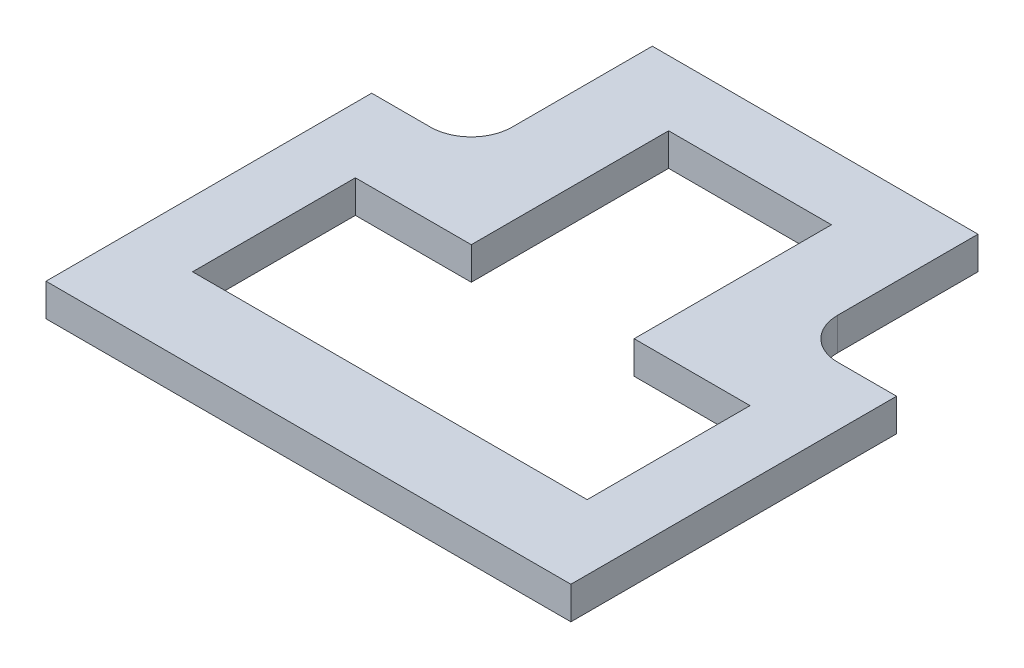
ISO-10303-21;
HEADER;
FILE_DESCRIPTION(('STEP AP214'),'2;1');
FILE_NAME('part.step','',(''),(''),'','','');
FILE_SCHEMA(('AUTOMOTIVE_DESIGN { 1 0 10303 214 1 1 1 1 }'));
ENDSEC;
DATA;
#1=APPLICATION_CONTEXT('core data for automotive mechanical design processes');
#2=APPLICATION_PROTOCOL_DEFINITION('international standard','automotive_design',2000,#1);
#3=PRODUCT_CONTEXT('',#1,'mechanical');
#4=PRODUCT('Part','Part','',(#3));
#5=PRODUCT_RELATED_PRODUCT_CATEGORY('part','',(#4));
#6=PRODUCT_DEFINITION_FORMATION('','',#4);
#7=PRODUCT_DEFINITION_CONTEXT('part definition',#1,'design');
#8=PRODUCT_DEFINITION('design','',#6,#7);
#9=PRODUCT_DEFINITION_SHAPE('','',#8);
#10=(LENGTH_UNIT() NAMED_UNIT(*) SI_UNIT(.MILLI.,.METRE.));
#11=(NAMED_UNIT(*) PLANE_ANGLE_UNIT() SI_UNIT($,.RADIAN.));
#12=(NAMED_UNIT(*) SI_UNIT($,.STERADIAN.) SOLID_ANGLE_UNIT());
#13=UNCERTAINTY_MEASURE_WITH_UNIT(LENGTH_MEASURE(1.E-05),#10,'distance_accuracy_value','');
#14=(GEOMETRIC_REPRESENTATION_CONTEXT(3) GLOBAL_UNCERTAINTY_ASSIGNED_CONTEXT((#13)) GLOBAL_UNIT_ASSIGNED_CONTEXT((#10,
#11,#12)) REPRESENTATION_CONTEXT('',''));
#15=CARTESIAN_POINT('',(0.,0.,0.));
#16=DIRECTION('',(0.,0.,1.));
#17=DIRECTION('',(1.,0.,0.));
#18=AXIS2_PLACEMENT_3D('',#15,#16,#17);
#19=CARTESIAN_POINT('',(37.5,14.,-7.49999999999994));
#20=DIRECTION('',(0.,-1.,0.));
#21=DIRECTION('',(0.,0.,-1.));
#22=AXIS2_PLACEMENT_3D('',#19,#20,#21);
#23=CYLINDRICAL_SURFACE('',#22,7.49999999999994);
#24=DIRECTION('',(0.,-1.,0.));
#25=VECTOR('',#24,1.);
#26=CARTESIAN_POINT('',(37.5,14.,0.));
#27=LINE('',#26,#25);
#28=CARTESIAN_POINT('',(37.5,14.,0.));
#29=VERTEX_POINT('',#28);
#30=CARTESIAN_POINT('',(37.5,8.,0.));
#31=VERTEX_POINT('',#30);
#32=EDGE_CURVE('E291',#29,#31,#27,.T.);
#33=ORIENTED_EDGE('',*,*,#32,.T.);
#34=CARTESIAN_POINT('',(37.5,8.,-7.49999999999994));
#35=DIRECTION('',(0.,1.,0.));
#36=DIRECTION('',(0.,0.,1.));
#37=AXIS2_PLACEMENT_3D('',#34,#35,#36);
#38=CIRCLE('',#37,7.49999999999994);
#39=CARTESIAN_POINT('',(30.,8.,-7.5));
#40=VERTEX_POINT('',#39);
#41=EDGE_CURVE('E249',#31,#40,#38,.F.);
#42=ORIENTED_EDGE('',*,*,#41,.T.);
#43=DIRECTION('',(0.,-1.,0.));
#44=VECTOR('',#43,1.);
#45=CARTESIAN_POINT('',(30.,14.,-7.5));
#46=LINE('',#45,#44);
#47=CARTESIAN_POINT('',(30.,14.,-7.5));
#48=VERTEX_POINT('',#47);
#49=EDGE_CURVE('E295',#48,#40,#46,.T.);
#50=ORIENTED_EDGE('',*,*,#49,.F.);
#51=CARTESIAN_POINT('',(37.5,14.,-7.49999999999994));
#52=DIRECTION('',(0.,-1.,0.));
#53=DIRECTION('',(0.,0.,-1.));
#54=AXIS2_PLACEMENT_3D('',#51,#52,#53);
#55=CIRCLE('',#54,7.49999999999994);
#56=EDGE_CURVE('E272',#29,#48,#55,.T.);
#57=ORIENTED_EDGE('',*,*,#56,.F.);
#58=EDGE_LOOP('',(#33,#42,#50,#57));
#59=FACE_BOUND('',#58,.T.);
#60=ADVANCED_FACE('F40',(#59),#23,.F.);
#61=CARTESIAN_POINT('',(-37.5,14.,-7.5));
#62=DIRECTION('',(0.,-1.,0.));
#63=DIRECTION('',(0.,0.,-1.));
#64=AXIS2_PLACEMENT_3D('',#61,#62,#63);
#65=CYLINDRICAL_SURFACE('',#64,7.5);
#66=DIRECTION('',(0.,-1.,0.));
#67=VECTOR('',#66,1.);
#68=CARTESIAN_POINT('',(-30.,14.,-7.5));
#69=LINE('',#68,#67);
#70=CARTESIAN_POINT('',(-30.,14.,-7.5));
#71=VERTEX_POINT('',#70);
#72=CARTESIAN_POINT('',(-30.,8.,-7.5));
#73=VERTEX_POINT('',#72);
#74=EDGE_CURVE('E298',#71,#73,#69,.T.);
#75=ORIENTED_EDGE('',*,*,#74,.T.);
#76=CARTESIAN_POINT('',(-37.5,8.,-7.5));
#77=DIRECTION('',(0.,1.,0.));
#78=DIRECTION('',(0.,0.,1.));
#79=AXIS2_PLACEMENT_3D('',#76,#77,#78);
#80=CIRCLE('',#79,7.5);
#81=CARTESIAN_POINT('',(-37.5,8.,0.));
#82=VERTEX_POINT('',#81);
#83=EDGE_CURVE('E246',#73,#82,#80,.F.);
#84=ORIENTED_EDGE('',*,*,#83,.T.);
#85=DIRECTION('',(0.,-1.,0.));
#86=VECTOR('',#85,1.);
#87=CARTESIAN_POINT('',(-37.5,14.,0.));
#88=LINE('',#87,#86);
#89=CARTESIAN_POINT('',(-37.5,14.,0.));
#90=VERTEX_POINT('',#89);
#91=EDGE_CURVE('E290',#90,#82,#88,.T.);
#92=ORIENTED_EDGE('',*,*,#91,.F.);
#93=CARTESIAN_POINT('',(-37.5,14.,-7.5));
#94=DIRECTION('',(0.,-1.,0.));
#95=DIRECTION('',(0.,0.,-1.));
#96=AXIS2_PLACEMENT_3D('',#93,#94,#95);
#97=CIRCLE('',#96,7.5);
#98=EDGE_CURVE('E266',#71,#90,#97,.T.);
#99=ORIENTED_EDGE('',*,*,#98,.F.);
#100=EDGE_LOOP('',(#75,#84,#92,#99));
#101=FACE_BOUND('',#100,.T.);
#102=ADVANCED_FACE('F346',(#101),#65,.F.);
#103=CARTESIAN_POINT('',(0.,14.,0.));
#104=DIRECTION('',(0.,-1.,0.));
#105=DIRECTION('',(0.,0.,-1.));
#106=AXIS2_PLACEMENT_3D('',#103,#104,#105);
#107=PLANE('',#106);
#108=DIRECTION('',(1.,0.,0.));
#109=VECTOR('',#108,1.);
#110=CARTESIAN_POINT('',(0.,14.,45.));
#111=LINE('',#110,#109);
#112=CARTESIAN_POINT('',(-36.35,14.,45.));
#113=VERTEX_POINT('',#112);
#114=CARTESIAN_POINT('',(36.35,14.,45.));
#115=VERTEX_POINT('',#114);
#116=EDGE_CURVE('E281',#113,#115,#111,.T.);
#117=ORIENTED_EDGE('',*,*,#116,.F.);
#118=DIRECTION('',(0.,0.,1.));
#119=VECTOR('',#118,1.);
#120=CARTESIAN_POINT('',(-36.35,14.,15.));
#121=LINE('',#120,#119);
#122=CARTESIAN_POINT('',(-36.35,14.,15.));
#123=VERTEX_POINT('',#122);
#124=EDGE_CURVE('E206',#123,#113,#121,.T.);
#125=ORIENTED_EDGE('',*,*,#124,.F.);
#126=DIRECTION('',(-1.,0.,0.));
#127=VECTOR('',#126,1.);
#128=CARTESIAN_POINT('',(0.,14.,15.));
#129=LINE('',#128,#127);
#130=CARTESIAN_POINT('',(-15.,14.,15.));
#131=VERTEX_POINT('',#130);
#132=EDGE_CURVE('E279',#131,#123,#129,.T.);
#133=ORIENTED_EDGE('',*,*,#132,.F.);
#134=DIRECTION('',(0.,0.,1.));
#135=VECTOR('',#134,1.);
#136=CARTESIAN_POINT('',(-15.,14.,0.));
#137=LINE('',#136,#135);
#138=CARTESIAN_POINT('',(-15.,14.,-21.35));
#139=VERTEX_POINT('',#138);
#140=EDGE_CURVE('E288',#139,#131,#137,.T.);
#141=ORIENTED_EDGE('',*,*,#140,.F.);
#142=DIRECTION('',(-1.,0.,0.));
#143=VECTOR('',#142,1.);
#144=CARTESIAN_POINT('',(-15.,14.,-21.35));
#145=LINE('',#144,#143);
#146=CARTESIAN_POINT('',(15.,14.,-21.35));
#147=VERTEX_POINT('',#146);
#148=EDGE_CURVE('E233',#147,#139,#145,.T.);
#149=ORIENTED_EDGE('',*,*,#148,.F.);
#150=DIRECTION('',(0.,0.,-1.));
#151=VECTOR('',#150,1.);
#152=CARTESIAN_POINT('',(15.,14.,0.));
#153=LINE('',#152,#151);
#154=CARTESIAN_POINT('',(15.,14.,15.));
#155=VERTEX_POINT('',#154);
#156=EDGE_CURVE('E286',#155,#147,#153,.T.);
#157=ORIENTED_EDGE('',*,*,#156,.F.);
#158=DIRECTION('',(-1.,0.,0.));
#159=VECTOR('',#158,1.);
#160=CARTESIAN_POINT('',(0.,14.,15.));
#161=LINE('',#160,#159);
#162=CARTESIAN_POINT('',(36.35,14.,15.));
#163=VERTEX_POINT('',#162);
#164=EDGE_CURVE('E283',#163,#155,#161,.T.);
#165=ORIENTED_EDGE('',*,*,#164,.F.);
#166=DIRECTION('',(0.,0.,-1.));
#167=VECTOR('',#166,1.);
#168=CARTESIAN_POINT('',(36.35,14.,15.));
#169=LINE('',#168,#167);
#170=EDGE_CURVE('E203',#115,#163,#169,.T.);
#171=ORIENTED_EDGE('',*,*,#170,.F.);
#172=EDGE_LOOP('',(#117,#125,#133,#141,#149,#157,#165,#171));
#173=FACE_BOUND('',#172,.T.);
#174=ORIENTED_EDGE('',*,*,#56,.T.);
#175=DIRECTION('',(0.,0.,1.));
#176=VECTOR('',#175,1.);
#177=CARTESIAN_POINT('',(30.,14.,0.));
#178=LINE('',#177,#176);
#179=CARTESIAN_POINT('',(30.,14.,-33.35));
#180=VERTEX_POINT('',#179);
#181=EDGE_CURVE('E270',#180,#48,#178,.T.);
#182=ORIENTED_EDGE('',*,*,#181,.F.);
#183=DIRECTION('',(-1.,0.,0.));
#184=VECTOR('',#183,1.);
#185=CARTESIAN_POINT('',(-30.,14.,-33.35));
#186=LINE('',#185,#184);
#187=CARTESIAN_POINT('',(-30.,14.,-33.35));
#188=VERTEX_POINT('',#187);
#189=EDGE_CURVE('E214',#180,#188,#186,.T.);
#190=ORIENTED_EDGE('',*,*,#189,.T.);
#191=DIRECTION('',(0.,0.,-1.));
#192=VECTOR('',#191,1.);
#193=CARTESIAN_POINT('',(-30.,14.,0.));
#194=LINE('',#193,#192);
#195=EDGE_CURVE('E268',#71,#188,#194,.T.);
#196=ORIENTED_EDGE('',*,*,#195,.F.);
#197=ORIENTED_EDGE('',*,*,#98,.T.);
#198=DIRECTION('',(1.,0.,0.));
#199=VECTOR('',#198,1.);
#200=CARTESIAN_POINT('',(0.,14.,0.));
#201=LINE('',#200,#199);
#202=CARTESIAN_POINT('',(-48.35,14.,0.));
#203=VERTEX_POINT('',#202);
#204=EDGE_CURVE('E263',#203,#90,#201,.T.);
#205=ORIENTED_EDGE('',*,*,#204,.F.);
#206=DIRECTION('',(0.,0.,1.));
#207=VECTOR('',#206,1.);
#208=CARTESIAN_POINT('',(-48.35,14.,0.));
#209=LINE('',#208,#207);
#210=CARTESIAN_POINT('',(-48.35,14.,60.));
#211=VERTEX_POINT('',#210);
#212=EDGE_CURVE('E195',#203,#211,#209,.T.);
#213=ORIENTED_EDGE('',*,*,#212,.T.);
#214=DIRECTION('',(-1.,0.,0.));
#215=VECTOR('',#214,1.);
#216=CARTESIAN_POINT('',(0.,14.,60.));
#217=LINE('',#216,#215);
#218=CARTESIAN_POINT('',(48.35,14.,60.));
#219=VERTEX_POINT('',#218);
#220=EDGE_CURVE('E277',#219,#211,#217,.T.);
#221=ORIENTED_EDGE('',*,*,#220,.F.);
#222=DIRECTION('',(0.,0.,-1.));
#223=VECTOR('',#222,1.);
#224=CARTESIAN_POINT('',(48.35,14.,0.));
#225=LINE('',#224,#223);
#226=CARTESIAN_POINT('',(48.35,14.,0.));
#227=VERTEX_POINT('',#226);
#228=EDGE_CURVE('E184',#219,#227,#225,.T.);
#229=ORIENTED_EDGE('',*,*,#228,.T.);
#230=DIRECTION('',(1.,0.,0.));
#231=VECTOR('',#230,1.);
#232=CARTESIAN_POINT('',(0.,14.,0.));
#233=LINE('',#232,#231);
#234=EDGE_CURVE('E275',#29,#227,#233,.T.);
#235=ORIENTED_EDGE('',*,*,#234,.F.);
#236=EDGE_LOOP('',(#174,#182,#190,#196,#197,#205,#213,#221,#229,#235));
#237=FACE_BOUND('',#236,.T.);
#238=ADVANCED_FACE('F324',(#173,#237),#107,.F.);
#239=CARTESIAN_POINT('',(-30.,6.,-30.));
#240=DIRECTION('',(1.,0.,0.));
#241=DIRECTION('',(0.,0.,-1.));
#242=AXIS2_PLACEMENT_3D('',#239,#240,#241);
#243=PLANE('',#242);
#244=ORIENTED_EDGE('',*,*,#195,.T.);
#245=DIRECTION('',(0.,1.,0.));
#246=VECTOR('',#245,1.);
#247=CARTESIAN_POINT('',(-30.,8.,-33.35));
#248=LINE('',#247,#246);
#249=CARTESIAN_POINT('',(-30.,8.,-33.35));
#250=VERTEX_POINT('',#249);
#251=EDGE_CURVE('E230',#250,#188,#248,.T.);
#252=ORIENTED_EDGE('',*,*,#251,.F.);
#253=DIRECTION('',(0.,0.,1.));
#254=VECTOR('',#253,1.);
#255=CARTESIAN_POINT('',(-30.,8.,-30.));
#256=LINE('',#255,#254);
#257=EDGE_CURVE('E244',#250,#73,#256,.T.);
#258=ORIENTED_EDGE('',*,*,#257,.T.);
#259=ORIENTED_EDGE('',*,*,#74,.F.);
#260=EDGE_LOOP('',(#244,#252,#258,#259));
#261=FACE_BOUND('',#260,.T.);
#262=ADVANCED_FACE('F42',(#261),#243,.F.);
#263=CARTESIAN_POINT('',(45.,6.,0.));
#264=DIRECTION('',(0.,0.,1.));
#265=DIRECTION('',(1.,0.,0.));
#266=AXIS2_PLACEMENT_3D('',#263,#264,#265);
#267=PLANE('',#266);
#268=ORIENTED_EDGE('',*,*,#234,.T.);
#269=DIRECTION('',(0.,1.,0.));
#270=VECTOR('',#269,1.);
#271=CARTESIAN_POINT('',(48.35,8.,0.));
#272=LINE('',#271,#270);
#273=CARTESIAN_POINT('',(48.35,8.,0.));
#274=VERTEX_POINT('',#273);
#275=EDGE_CURVE('E185',#274,#227,#272,.T.);
#276=ORIENTED_EDGE('',*,*,#275,.F.);
#277=DIRECTION('',(-1.,0.,0.));
#278=VECTOR('',#277,1.);
#279=CARTESIAN_POINT('',(45.,8.,0.));
#280=LINE('',#279,#278);
#281=EDGE_CURVE('E190',#274,#31,#280,.T.);
#282=ORIENTED_EDGE('',*,*,#281,.T.);
#283=ORIENTED_EDGE('',*,*,#32,.F.);
#284=EDGE_LOOP('',(#268,#276,#282,#283));
#285=FACE_BOUND('',#284,.T.);
#286=ADVANCED_FACE('F371',(#285),#267,.F.);
#287=CARTESIAN_POINT('',(-30.,6.,0.));
#288=DIRECTION('',(0.,0.,1.));
#289=DIRECTION('',(1.,0.,0.));
#290=AXIS2_PLACEMENT_3D('',#287,#288,#289);
#291=PLANE('',#290);
#292=ORIENTED_EDGE('',*,*,#91,.T.);
#293=DIRECTION('',(-1.,0.,0.));
#294=VECTOR('',#293,1.);
#295=CARTESIAN_POINT('',(-30.,8.,0.));
#296=LINE('',#295,#294);
#297=CARTESIAN_POINT('',(-48.35,8.,0.));
#298=VERTEX_POINT('',#297);
#299=EDGE_CURVE('E252',#82,#298,#296,.T.);
#300=ORIENTED_EDGE('',*,*,#299,.T.);
#301=DIRECTION('',(0.,1.,0.));
#302=VECTOR('',#301,1.);
#303=CARTESIAN_POINT('',(-48.35,8.,0.));
#304=LINE('',#303,#302);
#305=EDGE_CURVE('E199',#298,#203,#304,.T.);
#306=ORIENTED_EDGE('',*,*,#305,.T.);
#307=ORIENTED_EDGE('',*,*,#204,.T.);
#308=EDGE_LOOP('',(#292,#300,#306,#307));
#309=FACE_BOUND('',#308,.T.);
#310=ADVANCED_FACE('F374',(#309),#291,.F.);
#311=CARTESIAN_POINT('',(-45.,6.,60.));
#312=DIRECTION('',(0.,0.,-1.));
#313=DIRECTION('',(-1.,0.,0.));
#314=AXIS2_PLACEMENT_3D('',#311,#312,#313);
#315=PLANE('',#314);
#316=ORIENTED_EDGE('',*,*,#220,.T.);
#317=DIRECTION('',(0.,1.,0.));
#318=VECTOR('',#317,1.);
#319=CARTESIAN_POINT('',(-48.35,8.,60.));
#320=LINE('',#319,#318);
#321=CARTESIAN_POINT('',(-48.35,8.,60.));
#322=VERTEX_POINT('',#321);
#323=EDGE_CURVE('E170',#322,#211,#320,.T.);
#324=ORIENTED_EDGE('',*,*,#323,.F.);
#325=DIRECTION('',(-1.,0.,0.));
#326=VECTOR('',#325,1.);
#327=CARTESIAN_POINT('',(-45.,8.,60.));
#328=LINE('',#327,#326);
#329=CARTESIAN_POINT('',(48.35,8.,60.));
#330=VERTEX_POINT('',#329);
#331=EDGE_CURVE('E164',#330,#322,#328,.T.);
#332=ORIENTED_EDGE('',*,*,#331,.F.);
#333=DIRECTION('',(0.,1.,0.));
#334=VECTOR('',#333,1.);
#335=CARTESIAN_POINT('',(48.35,8.,60.));
#336=LINE('',#335,#334);
#337=EDGE_CURVE('E167',#330,#219,#336,.T.);
#338=ORIENTED_EDGE('',*,*,#337,.T.);
#339=EDGE_LOOP('',(#316,#324,#332,#338));
#340=FACE_BOUND('',#339,.T.);
#341=ADVANCED_FACE('F166',(#340),#315,.F.);
#342=CARTESIAN_POINT('',(30.,6.,0.));
#343=DIRECTION('',(-1.,0.,0.));
#344=DIRECTION('',(0.,0.,1.));
#345=AXIS2_PLACEMENT_3D('',#342,#343,#344);
#346=PLANE('',#345);
#347=DIRECTION('',(0.,0.,-1.));
#348=VECTOR('',#347,1.);
#349=CARTESIAN_POINT('',(30.,8.,0.));
#350=LINE('',#349,#348);
#351=CARTESIAN_POINT('',(30.,8.,-33.35));
#352=VERTEX_POINT('',#351);
#353=EDGE_CURVE('E175',#40,#352,#350,.T.);
#354=ORIENTED_EDGE('',*,*,#353,.T.);
#355=DIRECTION('',(0.,1.,0.));
#356=VECTOR('',#355,1.);
#357=CARTESIAN_POINT('',(30.,8.,-33.35));
#358=LINE('',#357,#356);
#359=EDGE_CURVE('E227',#352,#180,#358,.T.);
#360=ORIENTED_EDGE('',*,*,#359,.T.);
#361=ORIENTED_EDGE('',*,*,#181,.T.);
#362=ORIENTED_EDGE('',*,*,#49,.T.);
#363=EDGE_LOOP('',(#354,#360,#361,#362));
#364=FACE_BOUND('',#363,.T.);
#365=ADVANCED_FACE('F362',(#364),#346,.F.);
#366=CARTESIAN_POINT('',(30.,6.,45.));
#367=DIRECTION('',(0.,0.,1.));
#368=DIRECTION('',(1.,0.,0.));
#369=AXIS2_PLACEMENT_3D('',#366,#367,#368);
#370=PLANE('',#369);
#371=ORIENTED_EDGE('',*,*,#116,.T.);
#372=DIRECTION('',(0.,1.,0.));
#373=VECTOR('',#372,1.);
#374=CARTESIAN_POINT('',(36.35,4.,45.));
#375=LINE('',#374,#373);
#376=CARTESIAN_POINT('',(36.35,8.,45.));
#377=VERTEX_POINT('',#376);
#378=EDGE_CURVE('E219',#377,#115,#375,.T.);
#379=ORIENTED_EDGE('',*,*,#378,.F.);
#380=DIRECTION('',(-1.,0.,0.));
#381=VECTOR('',#380,1.);
#382=CARTESIAN_POINT('',(30.,8.,45.));
#383=LINE('',#382,#381);
#384=CARTESIAN_POINT('',(-36.35,8.,45.));
#385=VERTEX_POINT('',#384);
#386=EDGE_CURVE('E60',#377,#385,#383,.T.);
#387=ORIENTED_EDGE('',*,*,#386,.T.);
#388=DIRECTION('',(0.,1.,0.));
#389=VECTOR('',#388,1.);
#390=CARTESIAN_POINT('',(-36.35,4.,45.));
#391=LINE('',#390,#389);
#392=EDGE_CURVE('E211',#385,#113,#391,.T.);
#393=ORIENTED_EDGE('',*,*,#392,.T.);
#394=EDGE_LOOP('',(#371,#379,#387,#393));
#395=FACE_BOUND('',#394,.T.);
#396=ADVANCED_FACE('F358',(#395),#370,.F.);
#397=CARTESIAN_POINT('',(15.,6.,15.));
#398=DIRECTION('',(0.,0.,-1.));
#399=DIRECTION('',(-1.,0.,0.));
#400=AXIS2_PLACEMENT_3D('',#397,#398,#399);
#401=PLANE('',#400);
#402=DIRECTION('',(0.,-1.,0.));
#403=VECTOR('',#402,1.);
#404=CARTESIAN_POINT('',(15.,6.,15.));
#405=LINE('',#404,#403);
#406=CARTESIAN_POINT('',(15.,8.,15.));
#407=VERTEX_POINT('',#406);
#408=EDGE_CURVE('E303',#155,#407,#405,.T.);
#409=ORIENTED_EDGE('',*,*,#408,.T.);
#410=DIRECTION('',(1.,0.,0.));
#411=VECTOR('',#410,1.);
#412=CARTESIAN_POINT('',(15.,8.,15.));
#413=LINE('',#412,#411);
#414=CARTESIAN_POINT('',(36.35,8.,15.));
#415=VERTEX_POINT('',#414);
#416=EDGE_CURVE('E259',#407,#415,#413,.T.);
#417=ORIENTED_EDGE('',*,*,#416,.T.);
#418=DIRECTION('',(0.,1.,0.));
#419=VECTOR('',#418,1.);
#420=CARTESIAN_POINT('',(36.35,4.,15.));
#421=LINE('',#420,#419);
#422=EDGE_CURVE('E210',#415,#163,#421,.T.);
#423=ORIENTED_EDGE('',*,*,#422,.T.);
#424=ORIENTED_EDGE('',*,*,#164,.T.);
#425=EDGE_LOOP('',(#409,#417,#423,#424));
#426=FACE_BOUND('',#425,.T.);
#427=ADVANCED_FACE('F317',(#426),#401,.F.);
#428=CARTESIAN_POINT('',(15.,6.,-15.));
#429=DIRECTION('',(1.,0.,0.));
#430=DIRECTION('',(0.,0.,-1.));
#431=AXIS2_PLACEMENT_3D('',#428,#429,#430);
#432=PLANE('',#431);
#433=ORIENTED_EDGE('',*,*,#156,.T.);
#434=DIRECTION('',(0.,1.,0.));
#435=VECTOR('',#434,1.);
#436=CARTESIAN_POINT('',(15.,-5.81200000000001,-21.35));
#437=LINE('',#436,#435);
#438=CARTESIAN_POINT('',(15.,7.99999999999999,-21.35));
#439=VERTEX_POINT('',#438);
#440=EDGE_CURVE('E238',#439,#147,#437,.T.);
#441=ORIENTED_EDGE('',*,*,#440,.F.);
#442=DIRECTION('',(0.,0.,1.));
#443=VECTOR('',#442,1.);
#444=CARTESIAN_POINT('',(15.,8.,-15.));
#445=LINE('',#444,#443);
#446=EDGE_CURVE('E257',#439,#407,#445,.T.);
#447=ORIENTED_EDGE('',*,*,#446,.T.);
#448=ORIENTED_EDGE('',*,*,#408,.F.);
#449=EDGE_LOOP('',(#433,#441,#447,#448));
#450=FACE_BOUND('',#449,.T.);
#451=ADVANCED_FACE('F320',(#450),#432,.F.);
#452=CARTESIAN_POINT('',(-15.,6.,15.));
#453=DIRECTION('',(-1.,0.,0.));
#454=DIRECTION('',(0.,0.,1.));
#455=AXIS2_PLACEMENT_3D('',#452,#453,#454);
#456=PLANE('',#455);
#457=DIRECTION('',(0.,0.,-1.));
#458=VECTOR('',#457,1.);
#459=CARTESIAN_POINT('',(-15.,8.,15.));
#460=LINE('',#459,#458);
#461=CARTESIAN_POINT('',(-15.,8.,15.));
#462=VERTEX_POINT('',#461);
#463=CARTESIAN_POINT('',(-15.,7.99999999999999,-21.35));
#464=VERTEX_POINT('',#463);
#465=EDGE_CURVE('E255',#462,#464,#460,.T.);
#466=ORIENTED_EDGE('',*,*,#465,.T.);
#467=DIRECTION('',(0.,1.,0.));
#468=VECTOR('',#467,1.);
#469=CARTESIAN_POINT('',(-15.,-5.81200000000001,-21.35));
#470=LINE('',#469,#468);
#471=EDGE_CURVE('E176',#464,#139,#470,.T.);
#472=ORIENTED_EDGE('',*,*,#471,.T.);
#473=ORIENTED_EDGE('',*,*,#140,.T.);
#474=DIRECTION('',(0.,-1.,0.));
#475=VECTOR('',#474,1.);
#476=CARTESIAN_POINT('',(-15.,6.,15.));
#477=LINE('',#476,#475);
#478=EDGE_CURVE('E294',#131,#462,#477,.T.);
#479=ORIENTED_EDGE('',*,*,#478,.T.);
#480=EDGE_LOOP('',(#466,#472,#473,#479));
#481=FACE_BOUND('',#480,.T.);
#482=ADVANCED_FACE('F336',(#481),#456,.F.);
#483=CARTESIAN_POINT('',(-30.,6.,15.));
#484=DIRECTION('',(0.,0.,-1.));
#485=DIRECTION('',(-1.,0.,0.));
#486=AXIS2_PLACEMENT_3D('',#483,#484,#485);
#487=PLANE('',#486);
#488=ORIENTED_EDGE('',*,*,#132,.T.);
#489=DIRECTION('',(0.,1.,0.));
#490=VECTOR('',#489,1.);
#491=CARTESIAN_POINT('',(-36.35,4.,15.));
#492=LINE('',#491,#490);
#493=CARTESIAN_POINT('',(-36.35,8.,15.));
#494=VERTEX_POINT('',#493);
#495=EDGE_CURVE('E209',#494,#123,#492,.T.);
#496=ORIENTED_EDGE('',*,*,#495,.F.);
#497=DIRECTION('',(1.,0.,0.));
#498=VECTOR('',#497,1.);
#499=CARTESIAN_POINT('',(-30.,8.,15.));
#500=LINE('',#499,#498);
#501=EDGE_CURVE('E54',#494,#462,#500,.T.);
#502=ORIENTED_EDGE('',*,*,#501,.T.);
#503=ORIENTED_EDGE('',*,*,#478,.F.);
#504=EDGE_LOOP('',(#488,#496,#502,#503));
#505=FACE_BOUND('',#504,.T.);
#506=ADVANCED_FACE('F334',(#505),#487,.F.);
#507=CARTESIAN_POINT('',(-45.,8.,-33.));
#508=DIRECTION('',(0.,1.,0.));
#509=DIRECTION('',(0.,0.,1.));
#510=AXIS2_PLACEMENT_3D('',#507,#508,#509);
#511=PLANE('',#510);
#512=ORIENTED_EDGE('',*,*,#83,.F.);
#513=ORIENTED_EDGE('',*,*,#257,.F.);
#514=DIRECTION('',(-1.,0.,0.));
#515=VECTOR('',#514,1.);
#516=CARTESIAN_POINT('',(-30.,8.,-33.35));
#517=LINE('',#516,#515);
#518=EDGE_CURVE('E224',#352,#250,#517,.T.);
#519=ORIENTED_EDGE('',*,*,#518,.F.);
#520=ORIENTED_EDGE('',*,*,#353,.F.);
#521=ORIENTED_EDGE('',*,*,#41,.F.);
#522=ORIENTED_EDGE('',*,*,#281,.F.);
#523=DIRECTION('',(0.,0.,-1.));
#524=VECTOR('',#523,1.);
#525=CARTESIAN_POINT('',(48.35,8.,0.));
#526=LINE('',#525,#524);
#527=EDGE_CURVE('E182',#330,#274,#526,.T.);
#528=ORIENTED_EDGE('',*,*,#527,.F.);
#529=ORIENTED_EDGE('',*,*,#331,.T.);
#530=DIRECTION('',(0.,0.,1.));
#531=VECTOR('',#530,1.);
#532=CARTESIAN_POINT('',(-48.35,8.,0.));
#533=LINE('',#532,#531);
#534=EDGE_CURVE('E197',#298,#322,#533,.T.);
#535=ORIENTED_EDGE('',*,*,#534,.F.);
#536=ORIENTED_EDGE('',*,*,#299,.F.);
#537=EDGE_LOOP('',(#512,#513,#519,#520,#521,#522,#528,#529,#535,#536));
#538=FACE_BOUND('',#537,.T.);
#539=DIRECTION('',(0.,0.,1.));
#540=VECTOR('',#539,1.);
#541=CARTESIAN_POINT('',(-36.35,8.,-33.));
#542=LINE('',#541,#540);
#543=EDGE_CURVE('E11',#494,#385,#542,.T.);
#544=ORIENTED_EDGE('',*,*,#543,.T.);
#545=ORIENTED_EDGE('',*,*,#386,.F.);
#546=DIRECTION('',(0.,0.,-1.));
#547=VECTOR('',#546,1.);
#548=CARTESIAN_POINT('',(36.35,8.,-33.));
#549=LINE('',#548,#547);
#550=EDGE_CURVE('E48',#377,#415,#549,.T.);
#551=ORIENTED_EDGE('',*,*,#550,.T.);
#552=ORIENTED_EDGE('',*,*,#416,.F.);
#553=ORIENTED_EDGE('',*,*,#446,.F.);
#554=DIRECTION('',(-1.,0.,0.));
#555=VECTOR('',#554,1.);
#556=CARTESIAN_POINT('',(-45.,8.,-21.35));
#557=LINE('',#556,#555);
#558=EDGE_CURVE('E306',#439,#464,#557,.T.);
#559=ORIENTED_EDGE('',*,*,#558,.T.);
#560=ORIENTED_EDGE('',*,*,#465,.F.);
#561=ORIENTED_EDGE('',*,*,#501,.F.);
#562=EDGE_LOOP('',(#544,#545,#551,#552,#553,#559,#560,#561));
#563=FACE_BOUND('',#562,.T.);
#564=ADVANCED_FACE('F188',(#538,#563),#511,.F.);
#565=CARTESIAN_POINT('',(-15.,-5.81200000000001,-21.35));
#566=DIRECTION('',(0.,0.,-1.));
#567=DIRECTION('',(-1.,0.,0.));
#568=AXIS2_PLACEMENT_3D('',#565,#566,#567);
#569=PLANE('',#568);
#570=ORIENTED_EDGE('',*,*,#440,.T.);
#571=ORIENTED_EDGE('',*,*,#148,.T.);
#572=ORIENTED_EDGE('',*,*,#471,.F.);
#573=ORIENTED_EDGE('',*,*,#558,.F.);
#574=EDGE_LOOP('',(#570,#571,#572,#573));
#575=FACE_BOUND('',#574,.T.);
#576=ADVANCED_FACE('F329',(#575),#569,.F.);
#577=CARTESIAN_POINT('',(-30.,8.,-33.35));
#578=DIRECTION('',(0.,0.,-1.));
#579=DIRECTION('',(-1.,0.,0.));
#580=AXIS2_PLACEMENT_3D('',#577,#578,#579);
#581=PLANE('',#580);
#582=ORIENTED_EDGE('',*,*,#189,.F.);
#583=ORIENTED_EDGE('',*,*,#359,.F.);
#584=ORIENTED_EDGE('',*,*,#518,.T.);
#585=ORIENTED_EDGE('',*,*,#251,.T.);
#586=EDGE_LOOP('',(#582,#583,#584,#585));
#587=FACE_BOUND('',#586,.T.);
#588=ADVANCED_FACE('F393',(#587),#581,.T.);
#589=CARTESIAN_POINT('',(36.35,4.,15.));
#590=DIRECTION('',(1.,0.,0.));
#591=DIRECTION('',(0.,0.,-1.));
#592=AXIS2_PLACEMENT_3D('',#589,#590,#591);
#593=PLANE('',#592);
#594=ORIENTED_EDGE('',*,*,#378,.T.);
#595=ORIENTED_EDGE('',*,*,#170,.T.);
#596=ORIENTED_EDGE('',*,*,#422,.F.);
#597=ORIENTED_EDGE('',*,*,#550,.F.);
#598=EDGE_LOOP('',(#594,#595,#596,#597));
#599=FACE_BOUND('',#598,.T.);
#600=ADVANCED_FACE('F314',(#599),#593,.F.);
#601=CARTESIAN_POINT('',(-36.35,4.,15.));
#602=DIRECTION('',(-1.,0.,0.));
#603=DIRECTION('',(0.,0.,1.));
#604=AXIS2_PLACEMENT_3D('',#601,#602,#603);
#605=PLANE('',#604);
#606=ORIENTED_EDGE('',*,*,#495,.T.);
#607=ORIENTED_EDGE('',*,*,#124,.T.);
#608=ORIENTED_EDGE('',*,*,#392,.F.);
#609=ORIENTED_EDGE('',*,*,#543,.F.);
#610=EDGE_LOOP('',(#606,#607,#608,#609));
#611=FACE_BOUND('',#610,.T.);
#612=ADVANCED_FACE('F404',(#611),#605,.F.);
#613=CARTESIAN_POINT('',(-48.35,8.,0.));
#614=DIRECTION('',(-1.,0.,0.));
#615=DIRECTION('',(0.,0.,1.));
#616=AXIS2_PLACEMENT_3D('',#613,#614,#615);
#617=PLANE('',#616);
#618=ORIENTED_EDGE('',*,*,#212,.F.);
#619=ORIENTED_EDGE('',*,*,#305,.F.);
#620=ORIENTED_EDGE('',*,*,#534,.T.);
#621=ORIENTED_EDGE('',*,*,#323,.T.);
#622=EDGE_LOOP('',(#618,#619,#620,#621));
#623=FACE_BOUND('',#622,.T.);
#624=ADVANCED_FACE('F389',(#623),#617,.T.);
#625=CARTESIAN_POINT('',(48.35,8.,0.));
#626=DIRECTION('',(1.,0.,0.));
#627=DIRECTION('',(0.,0.,-1.));
#628=AXIS2_PLACEMENT_3D('',#625,#626,#627);
#629=PLANE('',#628);
#630=ORIENTED_EDGE('',*,*,#228,.F.);
#631=ORIENTED_EDGE('',*,*,#337,.F.);
#632=ORIENTED_EDGE('',*,*,#527,.T.);
#633=ORIENTED_EDGE('',*,*,#275,.T.);
#634=EDGE_LOOP('',(#630,#631,#632,#633));
#635=FACE_BOUND('',#634,.T.);
#636=ADVANCED_FACE('F180',(#635),#629,.T.);
#637=CLOSED_SHELL('',(#60,#102,#238,#262,#286,#310,#341,#365,#396,#427,#451,#482,#506,#564,#576,
#588,#600,#612,#624,#636));
#638=MANIFOLD_SOLID_BREP('B2',#637);
#639=ADVANCED_BREP_SHAPE_REPRESENTATION('',(#18,#638),#14);
#640=SHAPE_DEFINITION_REPRESENTATION(#9,#639);
ENDSEC;
END-ISO-10303-21;
